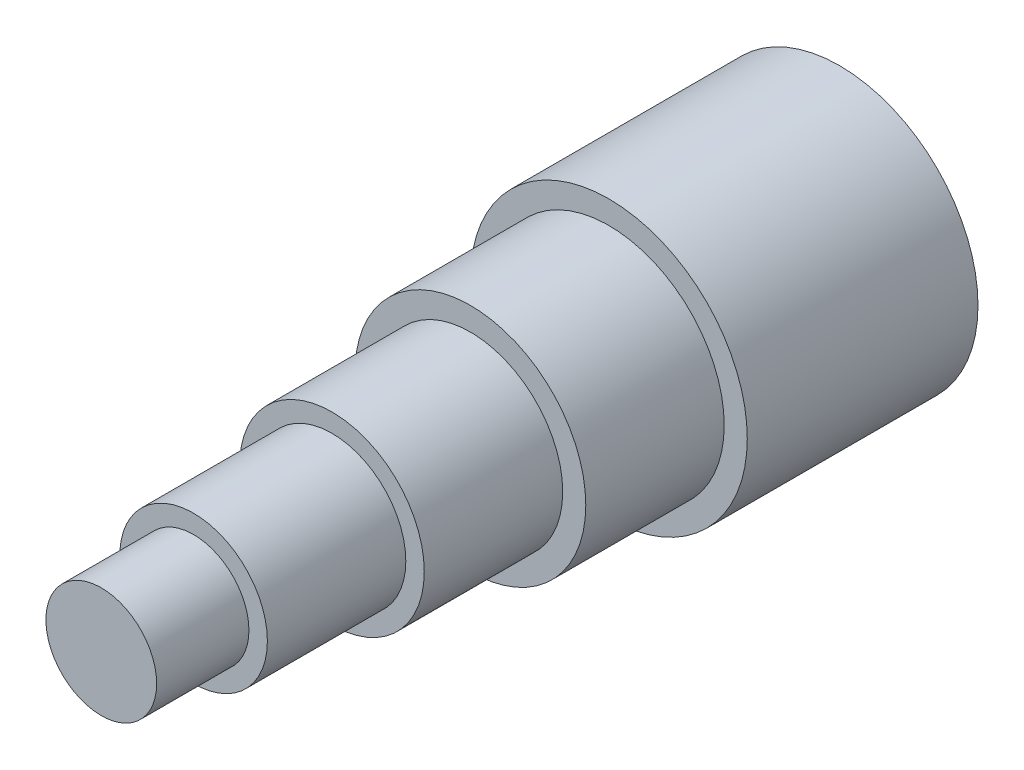
ISO-10303-21;
HEADER;
FILE_DESCRIPTION(('STEP AP214'),'2;1');
FILE_NAME('part.step','',(''),(''),'','','');
FILE_SCHEMA(('AUTOMOTIVE_DESIGN { 1 0 10303 214 1 1 1 1 }'));
ENDSEC;
DATA;
#1=APPLICATION_CONTEXT('core data for automotive mechanical design processes');
#2=APPLICATION_PROTOCOL_DEFINITION('international standard','automotive_design',2000,#1);
#3=PRODUCT_CONTEXT('',#1,'mechanical');
#4=PRODUCT('Part','Part','',(#3));
#5=PRODUCT_RELATED_PRODUCT_CATEGORY('part','',(#4));
#6=PRODUCT_DEFINITION_FORMATION('','',#4);
#7=PRODUCT_DEFINITION_CONTEXT('part definition',#1,'design');
#8=PRODUCT_DEFINITION('design','',#6,#7);
#9=PRODUCT_DEFINITION_SHAPE('','',#8);
#10=(LENGTH_UNIT() NAMED_UNIT(*) SI_UNIT(.MILLI.,.METRE.));
#11=(NAMED_UNIT(*) PLANE_ANGLE_UNIT() SI_UNIT($,.RADIAN.));
#12=(NAMED_UNIT(*) SI_UNIT($,.STERADIAN.) SOLID_ANGLE_UNIT());
#13=UNCERTAINTY_MEASURE_WITH_UNIT(LENGTH_MEASURE(1.E-05),#10,'distance_accuracy_value','');
#14=(GEOMETRIC_REPRESENTATION_CONTEXT(3) GLOBAL_UNCERTAINTY_ASSIGNED_CONTEXT((#13)) GLOBAL_UNIT_ASSIGNED_CONTEXT((#10,
#11,#12)) REPRESENTATION_CONTEXT('',''));
#15=CARTESIAN_POINT('',(0.,0.,0.));
#16=DIRECTION('',(0.,0.,1.));
#17=DIRECTION('',(1.,0.,0.));
#18=AXIS2_PLACEMENT_3D('',#15,#16,#17);
#19=CARTESIAN_POINT('',(0.,0.,15.));
#20=DIRECTION('',(0.,0.,1.));
#21=DIRECTION('',(1.,0.,0.));
#22=AXIS2_PLACEMENT_3D('',#19,#20,#21);
#23=CYLINDRICAL_SURFACE('',#22,8.);
#24=CARTESIAN_POINT('',(0.,0.,15.));
#25=DIRECTION('',(0.,0.,1.));
#26=DIRECTION('',(1.,0.,0.));
#27=AXIS2_PLACEMENT_3D('',#24,#25,#26);
#28=CIRCLE('',#27,8.);
#29=CARTESIAN_POINT('',(8.,0.,15.));
#30=VERTEX_POINT('',#29);
#31=EDGE_CURVE('E63',#30,#30,#28,.T.);
#32=ORIENTED_EDGE('',*,*,#31,.T.);
#33=EDGE_LOOP('',(#32));
#34=FACE_BOUND('',#33,.T.);
#35=CARTESIAN_POINT('',(0.,0.,30.));
#36=DIRECTION('',(0.,0.,1.));
#37=DIRECTION('',(1.,0.,0.));
#38=AXIS2_PLACEMENT_3D('',#35,#36,#37);
#39=CIRCLE('',#38,8.);
#40=CARTESIAN_POINT('',(8.,0.,30.));
#41=VERTEX_POINT('',#40);
#42=EDGE_CURVE('E66',#41,#41,#39,.T.);
#43=ORIENTED_EDGE('',*,*,#42,.F.);
#44=EDGE_LOOP('',(#43));
#45=FACE_BOUND('',#44,.T.);
#46=ADVANCED_FACE('F37',(#34,#45),#23,.T.);
#47=CARTESIAN_POINT('',(0.,0.,0.));
#48=DIRECTION('',(0.,0.,1.));
#49=DIRECTION('',(1.,0.,0.));
#50=AXIS2_PLACEMENT_3D('',#47,#48,#49);
#51=CYLINDRICAL_SURFACE('',#50,10.);
#52=CARTESIAN_POINT('',(0.,0.,0.));
#53=DIRECTION('',(0.,0.,1.));
#54=DIRECTION('',(1.,0.,0.));
#55=AXIS2_PLACEMENT_3D('',#52,#53,#54);
#56=CIRCLE('',#55,10.);
#57=CARTESIAN_POINT('',(10.,0.,0.));
#58=VERTEX_POINT('',#57);
#59=EDGE_CURVE('E57',#58,#58,#56,.T.);
#60=ORIENTED_EDGE('',*,*,#59,.T.);
#61=EDGE_LOOP('',(#60));
#62=FACE_BOUND('',#61,.T.);
#63=CARTESIAN_POINT('',(0.,0.,15.));
#64=DIRECTION('',(0.,0.,1.));
#65=DIRECTION('',(1.,0.,0.));
#66=AXIS2_PLACEMENT_3D('',#63,#64,#65);
#67=CIRCLE('',#66,10.);
#68=CARTESIAN_POINT('',(10.,0.,15.));
#69=VERTEX_POINT('',#68);
#70=EDGE_CURVE('E60',#69,#69,#67,.T.);
#71=ORIENTED_EDGE('',*,*,#70,.F.);
#72=EDGE_LOOP('',(#71));
#73=FACE_BOUND('',#72,.T.);
#74=ADVANCED_FACE('F87',(#62,#73),#51,.T.);
#75=CARTESIAN_POINT('',(0.,0.,-15.));
#76=DIRECTION('',(0.,0.,1.));
#77=DIRECTION('',(1.,0.,0.));
#78=AXIS2_PLACEMENT_3D('',#75,#76,#77);
#79=CYLINDRICAL_SURFACE('',#78,12.5);
#80=CARTESIAN_POINT('',(0.,0.,-15.));
#81=DIRECTION('',(0.,0.,1.));
#82=DIRECTION('',(1.,0.,0.));
#83=AXIS2_PLACEMENT_3D('',#80,#81,#82);
#84=CIRCLE('',#83,12.5);
#85=CARTESIAN_POINT('',(12.5,0.,-15.));
#86=VERTEX_POINT('',#85);
#87=EDGE_CURVE('E48',#86,#86,#84,.T.);
#88=ORIENTED_EDGE('',*,*,#87,.T.);
#89=EDGE_LOOP('',(#88));
#90=FACE_BOUND('',#89,.T.);
#91=CARTESIAN_POINT('',(0.,0.,0.));
#92=DIRECTION('',(0.,0.,1.));
#93=DIRECTION('',(1.,0.,0.));
#94=AXIS2_PLACEMENT_3D('',#91,#92,#93);
#95=CIRCLE('',#94,12.5);
#96=CARTESIAN_POINT('',(12.5,0.,0.));
#97=VERTEX_POINT('',#96);
#98=EDGE_CURVE('E52',#97,#97,#95,.T.);
#99=ORIENTED_EDGE('',*,*,#98,.F.);
#100=EDGE_LOOP('',(#99));
#101=FACE_BOUND('',#100,.T.);
#102=ADVANCED_FACE('F95',(#90,#101),#79,.T.);
#103=CARTESIAN_POINT('',(0.,0.,40.));
#104=DIRECTION('',(0.,0.,-1.));
#105=DIRECTION('',(-1.,0.,0.));
#106=AXIS2_PLACEMENT_3D('',#103,#104,#105);
#107=CYLINDRICAL_SURFACE('',#106,15.);
#108=CARTESIAN_POINT('',(0.,0.,-40.));
#109=DIRECTION('',(0.,0.,1.));
#110=DIRECTION('',(1.,0.,0.));
#111=AXIS2_PLACEMENT_3D('',#108,#109,#110);
#112=CIRCLE('',#111,15.);
#113=CARTESIAN_POINT('',(15.,0.,-40.));
#114=VERTEX_POINT('',#113);
#115=EDGE_CURVE('E10',#114,#114,#112,.T.);
#116=ORIENTED_EDGE('',*,*,#115,.T.);
#117=EDGE_LOOP('',(#116));
#118=FACE_BOUND('',#117,.T.);
#119=CARTESIAN_POINT('',(0.,0.,-15.));
#120=DIRECTION('',(0.,0.,1.));
#121=DIRECTION('',(1.,0.,0.));
#122=AXIS2_PLACEMENT_3D('',#119,#120,#121);
#123=CIRCLE('',#122,15.);
#124=CARTESIAN_POINT('',(15.,0.,-15.));
#125=VERTEX_POINT('',#124);
#126=EDGE_CURVE('E44',#125,#125,#123,.T.);
#127=ORIENTED_EDGE('',*,*,#126,.F.);
#128=EDGE_LOOP('',(#127));
#129=FACE_BOUND('',#128,.T.);
#130=ADVANCED_FACE('F39',(#118,#129),#107,.T.);
#131=CARTESIAN_POINT('',(0.,0.,-40.));
#132=DIRECTION('',(0.,0.,1.));
#133=DIRECTION('',(1.,0.,0.));
#134=AXIS2_PLACEMENT_3D('',#131,#132,#133);
#135=PLANE('',#134);
#136=ORIENTED_EDGE('',*,*,#115,.F.);
#137=EDGE_LOOP('',(#136));
#138=FACE_BOUND('',#137,.T.);
#139=ADVANCED_FACE('F109',(#138),#135,.F.);
#140=CARTESIAN_POINT('',(0.,0.,-15.));
#141=DIRECTION('',(0.,0.,1.));
#142=DIRECTION('',(1.,0.,0.));
#143=AXIS2_PLACEMENT_3D('',#140,#141,#142);
#144=PLANE('',#143);
#145=ORIENTED_EDGE('',*,*,#87,.F.);
#146=EDGE_LOOP('',(#145));
#147=FACE_BOUND('',#146,.T.);
#148=ORIENTED_EDGE('',*,*,#126,.T.);
#149=EDGE_LOOP('',(#148));
#150=FACE_BOUND('',#149,.T.);
#151=ADVANCED_FACE('F104',(#147,#150),#144,.T.);
#152=CARTESIAN_POINT('',(0.,0.,0.));
#153=DIRECTION('',(0.,0.,1.));
#154=DIRECTION('',(1.,0.,0.));
#155=AXIS2_PLACEMENT_3D('',#152,#153,#154);
#156=PLANE('',#155);
#157=ORIENTED_EDGE('',*,*,#59,.F.);
#158=EDGE_LOOP('',(#157));
#159=FACE_BOUND('',#158,.T.);
#160=ORIENTED_EDGE('',*,*,#98,.T.);
#161=EDGE_LOOP('',(#160));
#162=FACE_BOUND('',#161,.T.);
#163=ADVANCED_FACE('F102',(#159,#162),#156,.T.);
#164=CARTESIAN_POINT('',(0.,0.,15.));
#165=DIRECTION('',(0.,0.,1.));
#166=DIRECTION('',(1.,0.,0.));
#167=AXIS2_PLACEMENT_3D('',#164,#165,#166);
#168=PLANE('',#167);
#169=ORIENTED_EDGE('',*,*,#31,.F.);
#170=EDGE_LOOP('',(#169));
#171=FACE_BOUND('',#170,.T.);
#172=ORIENTED_EDGE('',*,*,#70,.T.);
#173=EDGE_LOOP('',(#172));
#174=FACE_BOUND('',#173,.T.);
#175=ADVANCED_FACE('F100',(#171,#174),#168,.T.);
#176=CARTESIAN_POINT('',(0.,0.,30.));
#177=DIRECTION('',(0.,0.,1.));
#178=DIRECTION('',(1.,0.,0.));
#179=AXIS2_PLACEMENT_3D('',#176,#177,#178);
#180=CYLINDRICAL_SURFACE('',#179,6.);
#181=CARTESIAN_POINT('',(0.,0.,30.));
#182=DIRECTION('',(0.,0.,1.));
#183=DIRECTION('',(1.,0.,0.));
#184=AXIS2_PLACEMENT_3D('',#181,#182,#183);
#185=CIRCLE('',#184,6.);
#186=CARTESIAN_POINT('',(6.,0.,30.));
#187=VERTEX_POINT('',#186);
#188=EDGE_CURVE('E70',#187,#187,#185,.T.);
#189=ORIENTED_EDGE('',*,*,#188,.T.);
#190=EDGE_LOOP('',(#189));
#191=FACE_BOUND('',#190,.T.);
#192=CARTESIAN_POINT('',(0.,0.,40.));
#193=DIRECTION('',(0.,0.,1.));
#194=DIRECTION('',(1.,0.,0.));
#195=AXIS2_PLACEMENT_3D('',#192,#193,#194);
#196=CIRCLE('',#195,6.);
#197=CARTESIAN_POINT('',(6.,0.,40.));
#198=VERTEX_POINT('',#197);
#199=EDGE_CURVE('E67',#198,#198,#196,.T.);
#200=ORIENTED_EDGE('',*,*,#199,.F.);
#201=EDGE_LOOP('',(#200));
#202=FACE_BOUND('',#201,.T.);
#203=ADVANCED_FACE('F76',(#191,#202),#180,.T.);
#204=CARTESIAN_POINT('',(0.,0.,30.));
#205=DIRECTION('',(0.,0.,1.));
#206=DIRECTION('',(1.,0.,0.));
#207=AXIS2_PLACEMENT_3D('',#204,#205,#206);
#208=PLANE('',#207);
#209=ORIENTED_EDGE('',*,*,#188,.F.);
#210=EDGE_LOOP('',(#209));
#211=FACE_BOUND('',#210,.T.);
#212=ORIENTED_EDGE('',*,*,#42,.T.);
#213=EDGE_LOOP('',(#212));
#214=FACE_BOUND('',#213,.T.);
#215=ADVANCED_FACE('F79',(#211,#214),#208,.T.);
#216=CARTESIAN_POINT('',(0.,0.,40.));
#217=DIRECTION('',(0.,0.,1.));
#218=DIRECTION('',(1.,0.,0.));
#219=AXIS2_PLACEMENT_3D('',#216,#217,#218);
#220=PLANE('',#219);
#221=ORIENTED_EDGE('',*,*,#199,.T.);
#222=EDGE_LOOP('',(#221));
#223=FACE_BOUND('',#222,.T.);
#224=ADVANCED_FACE('F82',(#223),#220,.T.);
#225=CLOSED_SHELL('',(#46,#74,#102,#130,#139,#151,#163,#175,#203,#215,#224));
#226=MANIFOLD_SOLID_BREP('B2',#225);
#227=ADVANCED_BREP_SHAPE_REPRESENTATION('',(#18,#226),#14);
#228=SHAPE_DEFINITION_REPRESENTATION(#9,#227);
ENDSEC;
END-ISO-10303-21;
